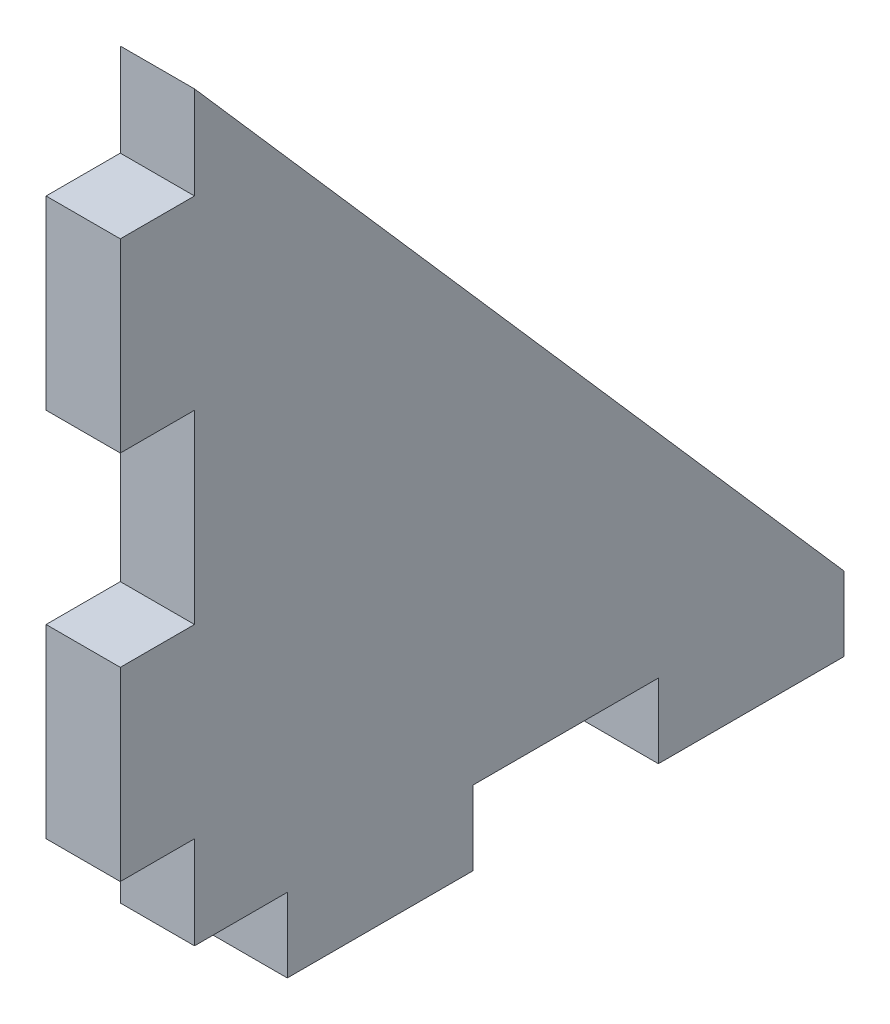
ISO-10303-21;
HEADER;
FILE_DESCRIPTION(('STEP AP214'),'2;1');
FILE_NAME('part.step','',(''),(''),'','','');
FILE_SCHEMA(('AUTOMOTIVE_DESIGN { 1 0 10303 214 1 1 1 1 }'));
ENDSEC;
DATA;
#1=APPLICATION_CONTEXT('core data for automotive mechanical design processes');
#2=APPLICATION_PROTOCOL_DEFINITION('international standard','automotive_design',2000,#1);
#3=PRODUCT_CONTEXT('',#1,'mechanical');
#4=PRODUCT('Part','Part','',(#3));
#5=PRODUCT_RELATED_PRODUCT_CATEGORY('part','',(#4));
#6=PRODUCT_DEFINITION_FORMATION('','',#4);
#7=PRODUCT_DEFINITION_CONTEXT('part definition',#1,'design');
#8=PRODUCT_DEFINITION('design','',#6,#7);
#9=PRODUCT_DEFINITION_SHAPE('','',#8);
#10=(LENGTH_UNIT() NAMED_UNIT(*) SI_UNIT(.MILLI.,.METRE.));
#11=(NAMED_UNIT(*) PLANE_ANGLE_UNIT() SI_UNIT($,.RADIAN.));
#12=(NAMED_UNIT(*) SI_UNIT($,.STERADIAN.) SOLID_ANGLE_UNIT());
#13=UNCERTAINTY_MEASURE_WITH_UNIT(LENGTH_MEASURE(1.E-05),#10,'distance_accuracy_value','');
#14=(GEOMETRIC_REPRESENTATION_CONTEXT(3) GLOBAL_UNCERTAINTY_ASSIGNED_CONTEXT((#13)) GLOBAL_UNIT_ASSIGNED_CONTEXT((#10,
#11,#12)) REPRESENTATION_CONTEXT('',''));
#15=CARTESIAN_POINT('',(0.,0.,0.));
#16=DIRECTION('',(0.,0.,1.));
#17=DIRECTION('',(1.,0.,0.));
#18=AXIS2_PLACEMENT_3D('',#15,#16,#17);
#19=CARTESIAN_POINT('',(2.,0.,-5.));
#20=DIRECTION('',(0.,1.,0.));
#21=DIRECTION('',(0.,0.,1.));
#22=AXIS2_PLACEMENT_3D('',#19,#20,#21);
#23=PLANE('',#22);
#24=DIRECTION('',(0.,0.,-1.));
#25=VECTOR('',#24,1.);
#26=CARTESIAN_POINT('',(-2.,0.,-5.));
#27=LINE('',#26,#25);
#28=CARTESIAN_POINT('',(-2.,0.,0.));
#29=VERTEX_POINT('',#28);
#30=CARTESIAN_POINT('',(-2.,0.,-5.));
#31=VERTEX_POINT('',#30);
#32=EDGE_CURVE('E198',#29,#31,#27,.T.);
#33=ORIENTED_EDGE('',*,*,#32,.T.);
#34=DIRECTION('',(-1.,0.,0.));
#35=VECTOR('',#34,1.);
#36=CARTESIAN_POINT('',(2.,0.,-5.));
#37=LINE('',#36,#35);
#38=CARTESIAN_POINT('',(2.,0.,-5.));
#39=VERTEX_POINT('',#38);
#40=EDGE_CURVE('E11',#39,#31,#37,.T.);
#41=ORIENTED_EDGE('',*,*,#40,.F.);
#42=DIRECTION('',(0.,0.,-1.));
#43=VECTOR('',#42,1.);
#44=CARTESIAN_POINT('',(2.,0.,-5.));
#45=LINE('',#44,#43);
#46=CARTESIAN_POINT('',(2.,0.,0.));
#47=VERTEX_POINT('',#46);
#48=EDGE_CURVE('E232',#47,#39,#45,.T.);
#49=ORIENTED_EDGE('',*,*,#48,.F.);
#50=DIRECTION('',(-1.,0.,0.));
#51=VECTOR('',#50,1.);
#52=CARTESIAN_POINT('',(2.,0.,0.));
#53=LINE('',#52,#51);
#54=EDGE_CURVE('E194',#47,#29,#53,.T.);
#55=ORIENTED_EDGE('',*,*,#54,.T.);
#56=EDGE_LOOP('',(#33,#41,#49,#55));
#57=FACE_BOUND('',#56,.T.);
#58=ADVANCED_FACE('F42',(#57),#23,.F.);
#59=CARTESIAN_POINT('',(2.,-4.,-5.));
#60=DIRECTION('',(0.,0.,-1.));
#61=DIRECTION('',(-1.,0.,0.));
#62=AXIS2_PLACEMENT_3D('',#59,#60,#61);
#63=PLANE('',#62);
#64=DIRECTION('',(0.,-1.,0.));
#65=VECTOR('',#64,1.);
#66=CARTESIAN_POINT('',(-2.,-4.,-5.));
#67=LINE('',#66,#65);
#68=CARTESIAN_POINT('',(-2.,-4.,-5.));
#69=VERTEX_POINT('',#68);
#70=EDGE_CURVE('E201',#31,#69,#67,.T.);
#71=ORIENTED_EDGE('',*,*,#70,.T.);
#72=DIRECTION('',(-1.,0.,0.));
#73=VECTOR('',#72,1.);
#74=CARTESIAN_POINT('',(2.,-4.,-5.));
#75=LINE('',#74,#73);
#76=CARTESIAN_POINT('',(2.,-4.,-5.));
#77=VERTEX_POINT('',#76);
#78=EDGE_CURVE('E50',#77,#69,#75,.T.);
#79=ORIENTED_EDGE('',*,*,#78,.F.);
#80=DIRECTION('',(0.,-1.,0.));
#81=VECTOR('',#80,1.);
#82=CARTESIAN_POINT('',(2.,-4.,-5.));
#83=LINE('',#82,#81);
#84=EDGE_CURVE('E131',#39,#77,#83,.T.);
#85=ORIENTED_EDGE('',*,*,#84,.F.);
#86=ORIENTED_EDGE('',*,*,#40,.T.);
#87=EDGE_LOOP('',(#71,#79,#85,#86));
#88=FACE_BOUND('',#87,.T.);
#89=ADVANCED_FACE('F340',(#88),#63,.F.);
#90=CARTESIAN_POINT('',(2.,-4.,-15.));
#91=DIRECTION('',(0.,1.,0.));
#92=DIRECTION('',(0.,0.,1.));
#93=AXIS2_PLACEMENT_3D('',#90,#91,#92);
#94=PLANE('',#93);
#95=DIRECTION('',(0.,0.,-1.));
#96=VECTOR('',#95,1.);
#97=CARTESIAN_POINT('',(-2.,-4.,-15.));
#98=LINE('',#97,#96);
#99=CARTESIAN_POINT('',(-2.,-4.,-15.));
#100=VERTEX_POINT('',#99);
#101=EDGE_CURVE('E203',#69,#100,#98,.T.);
#102=ORIENTED_EDGE('',*,*,#101,.T.);
#103=DIRECTION('',(-1.,0.,0.));
#104=VECTOR('',#103,1.);
#105=CARTESIAN_POINT('',(2.,-4.,-15.));
#106=LINE('',#105,#104);
#107=CARTESIAN_POINT('',(2.,-4.,-15.));
#108=VERTEX_POINT('',#107);
#109=EDGE_CURVE('E269',#108,#100,#106,.T.);
#110=ORIENTED_EDGE('',*,*,#109,.F.);
#111=DIRECTION('',(0.,0.,-1.));
#112=VECTOR('',#111,1.);
#113=CARTESIAN_POINT('',(2.,-4.,-15.));
#114=LINE('',#113,#112);
#115=EDGE_CURVE('E277',#77,#108,#114,.T.);
#116=ORIENTED_EDGE('',*,*,#115,.F.);
#117=ORIENTED_EDGE('',*,*,#78,.T.);
#118=EDGE_LOOP('',(#102,#110,#116,#117));
#119=FACE_BOUND('',#118,.T.);
#120=ADVANCED_FACE('F275',(#119),#94,.F.);
#121=CARTESIAN_POINT('',(2.,0.,-15.));
#122=DIRECTION('',(0.,0.,1.));
#123=DIRECTION('',(0.,-1.,0.));
#124=AXIS2_PLACEMENT_3D('',#121,#122,#123);
#125=PLANE('',#124);
#126=DIRECTION('',(0.,1.,0.));
#127=VECTOR('',#126,1.);
#128=CARTESIAN_POINT('',(-2.,0.,-15.));
#129=LINE('',#128,#127);
#130=CARTESIAN_POINT('',(-2.,0.,-15.));
#131=VERTEX_POINT('',#130);
#132=EDGE_CURVE('E205',#100,#131,#129,.T.);
#133=ORIENTED_EDGE('',*,*,#132,.T.);
#134=DIRECTION('',(-1.,0.,0.));
#135=VECTOR('',#134,1.);
#136=CARTESIAN_POINT('',(2.,0.,-15.));
#137=LINE('',#136,#135);
#138=CARTESIAN_POINT('',(2.,0.,-15.));
#139=VERTEX_POINT('',#138);
#140=EDGE_CURVE('E266',#139,#131,#137,.T.);
#141=ORIENTED_EDGE('',*,*,#140,.F.);
#142=DIRECTION('',(0.,1.,0.));
#143=VECTOR('',#142,1.);
#144=CARTESIAN_POINT('',(2.,0.,-15.));
#145=LINE('',#144,#143);
#146=EDGE_CURVE('E295',#108,#139,#145,.T.);
#147=ORIENTED_EDGE('',*,*,#146,.F.);
#148=ORIENTED_EDGE('',*,*,#109,.T.);
#149=EDGE_LOOP('',(#133,#141,#147,#148));
#150=FACE_BOUND('',#149,.T.);
#151=ADVANCED_FACE('F286',(#150),#125,.F.);
#152=CARTESIAN_POINT('',(2.,0.,-25.));
#153=DIRECTION('',(0.,1.,0.));
#154=DIRECTION('',(0.,0.,1.));
#155=AXIS2_PLACEMENT_3D('',#152,#153,#154);
#156=PLANE('',#155);
#157=DIRECTION('',(0.,0.,-1.));
#158=VECTOR('',#157,1.);
#159=CARTESIAN_POINT('',(-2.,0.,-25.));
#160=LINE('',#159,#158);
#161=CARTESIAN_POINT('',(-2.,0.,-25.));
#162=VERTEX_POINT('',#161);
#163=EDGE_CURVE('E207',#131,#162,#160,.T.);
#164=ORIENTED_EDGE('',*,*,#163,.T.);
#165=DIRECTION('',(-1.,0.,0.));
#166=VECTOR('',#165,1.);
#167=CARTESIAN_POINT('',(2.,0.,-25.));
#168=LINE('',#167,#166);
#169=CARTESIAN_POINT('',(2.,0.,-25.));
#170=VERTEX_POINT('',#169);
#171=EDGE_CURVE('E263',#170,#162,#168,.T.);
#172=ORIENTED_EDGE('',*,*,#171,.F.);
#173=DIRECTION('',(0.,0.,-1.));
#174=VECTOR('',#173,1.);
#175=CARTESIAN_POINT('',(2.,0.,-25.));
#176=LINE('',#175,#174);
#177=EDGE_CURVE('E292',#139,#170,#176,.T.);
#178=ORIENTED_EDGE('',*,*,#177,.F.);
#179=ORIENTED_EDGE('',*,*,#140,.T.);
#180=EDGE_LOOP('',(#164,#172,#178,#179));
#181=FACE_BOUND('',#180,.T.);
#182=ADVANCED_FACE('F290',(#181),#156,.F.);
#183=CARTESIAN_POINT('',(2.,-4.,-25.));
#184=DIRECTION('',(0.,0.,-1.));
#185=DIRECTION('',(-1.,0.,0.));
#186=AXIS2_PLACEMENT_3D('',#183,#184,#185);
#187=PLANE('',#186);
#188=DIRECTION('',(0.,-1.,0.));
#189=VECTOR('',#188,1.);
#190=CARTESIAN_POINT('',(-2.,-4.,-25.));
#191=LINE('',#190,#189);
#192=CARTESIAN_POINT('',(-2.,-4.,-25.));
#193=VERTEX_POINT('',#192);
#194=EDGE_CURVE('E209',#162,#193,#191,.T.);
#195=ORIENTED_EDGE('',*,*,#194,.T.);
#196=DIRECTION('',(-1.,0.,0.));
#197=VECTOR('',#196,1.);
#198=CARTESIAN_POINT('',(2.,-4.,-25.));
#199=LINE('',#198,#197);
#200=CARTESIAN_POINT('',(2.,-4.,-25.));
#201=VERTEX_POINT('',#200);
#202=EDGE_CURVE('E260',#201,#193,#199,.T.);
#203=ORIENTED_EDGE('',*,*,#202,.F.);
#204=DIRECTION('',(0.,-1.,0.));
#205=VECTOR('',#204,1.);
#206=CARTESIAN_POINT('',(2.,-4.,-25.));
#207=LINE('',#206,#205);
#208=EDGE_CURVE('E294',#170,#201,#207,.T.);
#209=ORIENTED_EDGE('',*,*,#208,.F.);
#210=ORIENTED_EDGE('',*,*,#171,.T.);
#211=EDGE_LOOP('',(#195,#203,#209,#210));
#212=FACE_BOUND('',#211,.T.);
#213=ADVANCED_FACE('F353',(#212),#187,.F.);
#214=CARTESIAN_POINT('',(2.,-4.,-35.));
#215=DIRECTION('',(0.,1.,0.));
#216=DIRECTION('',(0.,0.,1.));
#217=AXIS2_PLACEMENT_3D('',#214,#215,#216);
#218=PLANE('',#217);
#219=DIRECTION('',(0.,0.,-1.));
#220=VECTOR('',#219,1.);
#221=CARTESIAN_POINT('',(-2.,-4.,-35.));
#222=LINE('',#221,#220);
#223=CARTESIAN_POINT('',(-2.,-4.,-35.));
#224=VERTEX_POINT('',#223);
#225=EDGE_CURVE('E211',#193,#224,#222,.T.);
#226=ORIENTED_EDGE('',*,*,#225,.T.);
#227=DIRECTION('',(-1.,0.,0.));
#228=VECTOR('',#227,1.);
#229=CARTESIAN_POINT('',(2.,-4.,-35.));
#230=LINE('',#229,#228);
#231=CARTESIAN_POINT('',(2.,-4.,-35.));
#232=VERTEX_POINT('',#231);
#233=EDGE_CURVE('E257',#232,#224,#230,.T.);
#234=ORIENTED_EDGE('',*,*,#233,.F.);
#235=DIRECTION('',(0.,0.,-1.));
#236=VECTOR('',#235,1.);
#237=CARTESIAN_POINT('',(2.,-4.,-35.));
#238=LINE('',#237,#236);
#239=EDGE_CURVE('E297',#201,#232,#238,.T.);
#240=ORIENTED_EDGE('',*,*,#239,.F.);
#241=ORIENTED_EDGE('',*,*,#202,.T.);
#242=EDGE_LOOP('',(#226,#234,#240,#241));
#243=FACE_BOUND('',#242,.T.);
#244=ADVANCED_FACE('F356',(#243),#218,.F.);
#245=CARTESIAN_POINT('',(2.,0.,-35.));
#246=DIRECTION('',(0.,0.,1.));
#247=DIRECTION('',(1.,0.,0.));
#248=AXIS2_PLACEMENT_3D('',#245,#246,#247);
#249=PLANE('',#248);
#250=DIRECTION('',(0.,1.,0.));
#251=VECTOR('',#250,1.);
#252=CARTESIAN_POINT('',(-2.,0.,-35.));
#253=LINE('',#252,#251);
#254=CARTESIAN_POINT('',(-2.,0.,-35.));
#255=VERTEX_POINT('',#254);
#256=EDGE_CURVE('E213',#224,#255,#253,.T.);
#257=ORIENTED_EDGE('',*,*,#256,.T.);
#258=DIRECTION('',(-1.,0.,0.));
#259=VECTOR('',#258,1.);
#260=CARTESIAN_POINT('',(2.,0.,-35.));
#261=LINE('',#260,#259);
#262=CARTESIAN_POINT('',(2.,0.,-35.));
#263=VERTEX_POINT('',#262);
#264=EDGE_CURVE('E254',#263,#255,#261,.T.);
#265=ORIENTED_EDGE('',*,*,#264,.F.);
#266=DIRECTION('',(0.,1.,0.));
#267=VECTOR('',#266,1.);
#268=CARTESIAN_POINT('',(2.,0.,-35.));
#269=LINE('',#268,#267);
#270=EDGE_CURVE('E303',#232,#263,#269,.T.);
#271=ORIENTED_EDGE('',*,*,#270,.F.);
#272=ORIENTED_EDGE('',*,*,#233,.T.);
#273=EDGE_LOOP('',(#257,#265,#271,#272));
#274=FACE_BOUND('',#273,.T.);
#275=ADVANCED_FACE('F360',(#274),#249,.F.);
#276=CARTESIAN_POINT('',(2.,40.,0.));
#277=DIRECTION('',(0.,-0.658504607868518,0.752576694706878));
#278=DIRECTION('',(0.,-0.752576694706878,-0.658504607868518));
#279=AXIS2_PLACEMENT_3D('',#276,#277,#278);
#280=PLANE('',#279);
#281=DIRECTION('',(0.,0.752576694706878,0.658504607868518));
#282=VECTOR('',#281,1.);
#283=CARTESIAN_POINT('',(-2.,40.,0.));
#284=LINE('',#283,#282);
#285=CARTESIAN_POINT('',(-2.,40.,0.));
#286=VERTEX_POINT('',#285);
#287=EDGE_CURVE('E215',#255,#286,#284,.T.);
#288=ORIENTED_EDGE('',*,*,#287,.T.);
#289=DIRECTION('',(-1.,0.,0.));
#290=VECTOR('',#289,1.);
#291=CARTESIAN_POINT('',(2.,40.,0.));
#292=LINE('',#291,#290);
#293=CARTESIAN_POINT('',(2.,40.,0.));
#294=VERTEX_POINT('',#293);
#295=EDGE_CURVE('E251',#294,#286,#292,.T.);
#296=ORIENTED_EDGE('',*,*,#295,.F.);
#297=DIRECTION('',(0.,0.752576694706878,0.658504607868518));
#298=VECTOR('',#297,1.);
#299=CARTESIAN_POINT('',(2.,40.,0.));
#300=LINE('',#299,#298);
#301=EDGE_CURVE('E305',#263,#294,#300,.T.);
#302=ORIENTED_EDGE('',*,*,#301,.F.);
#303=ORIENTED_EDGE('',*,*,#264,.T.);
#304=EDGE_LOOP('',(#288,#296,#302,#303));
#305=FACE_BOUND('',#304,.T.);
#306=ADVANCED_FACE('F364',(#305),#280,.F.);
#307=CARTESIAN_POINT('',(2.,35.,0.));
#308=DIRECTION('',(0.,0.,-1.));
#309=DIRECTION('',(-1.,0.,0.));
#310=AXIS2_PLACEMENT_3D('',#307,#308,#309);
#311=PLANE('',#310);
#312=DIRECTION('',(0.,-1.,0.));
#313=VECTOR('',#312,1.);
#314=CARTESIAN_POINT('',(-2.,35.,0.));
#315=LINE('',#314,#313);
#316=CARTESIAN_POINT('',(-2.,35.,0.));
#317=VERTEX_POINT('',#316);
#318=EDGE_CURVE('E217',#286,#317,#315,.T.);
#319=ORIENTED_EDGE('',*,*,#318,.T.);
#320=DIRECTION('',(-1.,0.,0.));
#321=VECTOR('',#320,1.);
#322=CARTESIAN_POINT('',(2.,35.,0.));
#323=LINE('',#322,#321);
#324=CARTESIAN_POINT('',(2.,35.,0.));
#325=VERTEX_POINT('',#324);
#326=EDGE_CURVE('E248',#325,#317,#323,.T.);
#327=ORIENTED_EDGE('',*,*,#326,.F.);
#328=DIRECTION('',(0.,-1.,0.));
#329=VECTOR('',#328,1.);
#330=CARTESIAN_POINT('',(2.,35.,0.));
#331=LINE('',#330,#329);
#332=EDGE_CURVE('E307',#294,#325,#331,.T.);
#333=ORIENTED_EDGE('',*,*,#332,.F.);
#334=ORIENTED_EDGE('',*,*,#295,.T.);
#335=EDGE_LOOP('',(#319,#327,#333,#334));
#336=FACE_BOUND('',#335,.T.);
#337=ADVANCED_FACE('F368',(#336),#311,.F.);
#338=CARTESIAN_POINT('',(2.,35.,4.));
#339=DIRECTION('',(0.,-1.,0.));
#340=DIRECTION('',(0.,0.,-1.));
#341=AXIS2_PLACEMENT_3D('',#338,#339,#340);
#342=PLANE('',#341);
#343=DIRECTION('',(0.,0.,1.));
#344=VECTOR('',#343,1.);
#345=CARTESIAN_POINT('',(-2.,35.,4.));
#346=LINE('',#345,#344);
#347=CARTESIAN_POINT('',(-2.,35.,4.));
#348=VERTEX_POINT('',#347);
#349=EDGE_CURVE('E219',#317,#348,#346,.T.);
#350=ORIENTED_EDGE('',*,*,#349,.T.);
#351=DIRECTION('',(-1.,0.,0.));
#352=VECTOR('',#351,1.);
#353=CARTESIAN_POINT('',(2.,35.,4.));
#354=LINE('',#353,#352);
#355=CARTESIAN_POINT('',(2.,35.,4.));
#356=VERTEX_POINT('',#355);
#357=EDGE_CURVE('E245',#356,#348,#354,.T.);
#358=ORIENTED_EDGE('',*,*,#357,.F.);
#359=DIRECTION('',(0.,0.,1.));
#360=VECTOR('',#359,1.);
#361=CARTESIAN_POINT('',(2.,35.,4.));
#362=LINE('',#361,#360);
#363=EDGE_CURVE('E309',#325,#356,#362,.T.);
#364=ORIENTED_EDGE('',*,*,#363,.F.);
#365=ORIENTED_EDGE('',*,*,#326,.T.);
#366=EDGE_LOOP('',(#350,#358,#364,#365));
#367=FACE_BOUND('',#366,.T.);
#368=ADVANCED_FACE('F372',(#367),#342,.F.);
#369=CARTESIAN_POINT('',(2.,25.,4.));
#370=DIRECTION('',(0.,0.,-1.));
#371=DIRECTION('',(-1.,0.,0.));
#372=AXIS2_PLACEMENT_3D('',#369,#370,#371);
#373=PLANE('',#372);
#374=DIRECTION('',(0.,-1.,0.));
#375=VECTOR('',#374,1.);
#376=CARTESIAN_POINT('',(-2.,25.,4.));
#377=LINE('',#376,#375);
#378=CARTESIAN_POINT('',(-2.,25.,4.));
#379=VERTEX_POINT('',#378);
#380=EDGE_CURVE('E221',#348,#379,#377,.T.);
#381=ORIENTED_EDGE('',*,*,#380,.T.);
#382=DIRECTION('',(-1.,0.,0.));
#383=VECTOR('',#382,1.);
#384=CARTESIAN_POINT('',(2.,25.,4.));
#385=LINE('',#384,#383);
#386=CARTESIAN_POINT('',(2.,25.,4.));
#387=VERTEX_POINT('',#386);
#388=EDGE_CURVE('E242',#387,#379,#385,.T.);
#389=ORIENTED_EDGE('',*,*,#388,.F.);
#390=DIRECTION('',(0.,-1.,0.));
#391=VECTOR('',#390,1.);
#392=CARTESIAN_POINT('',(2.,25.,4.));
#393=LINE('',#392,#391);
#394=EDGE_CURVE('E311',#356,#387,#393,.T.);
#395=ORIENTED_EDGE('',*,*,#394,.F.);
#396=ORIENTED_EDGE('',*,*,#357,.T.);
#397=EDGE_LOOP('',(#381,#389,#395,#396));
#398=FACE_BOUND('',#397,.T.);
#399=ADVANCED_FACE('F376',(#398),#373,.F.);
#400=CARTESIAN_POINT('',(2.,25.,0.));
#401=DIRECTION('',(0.,1.,0.));
#402=DIRECTION('',(0.,0.,1.));
#403=AXIS2_PLACEMENT_3D('',#400,#401,#402);
#404=PLANE('',#403);
#405=DIRECTION('',(0.,0.,-1.));
#406=VECTOR('',#405,1.);
#407=CARTESIAN_POINT('',(-2.,25.,0.));
#408=LINE('',#407,#406);
#409=CARTESIAN_POINT('',(-2.,25.,0.));
#410=VERTEX_POINT('',#409);
#411=EDGE_CURVE('E223',#379,#410,#408,.T.);
#412=ORIENTED_EDGE('',*,*,#411,.T.);
#413=DIRECTION('',(-1.,0.,0.));
#414=VECTOR('',#413,1.);
#415=CARTESIAN_POINT('',(2.,25.,0.));
#416=LINE('',#415,#414);
#417=CARTESIAN_POINT('',(2.,25.,0.));
#418=VERTEX_POINT('',#417);
#419=EDGE_CURVE('E239',#418,#410,#416,.T.);
#420=ORIENTED_EDGE('',*,*,#419,.F.);
#421=DIRECTION('',(0.,0.,-1.));
#422=VECTOR('',#421,1.);
#423=CARTESIAN_POINT('',(2.,25.,0.));
#424=LINE('',#423,#422);
#425=EDGE_CURVE('E313',#387,#418,#424,.T.);
#426=ORIENTED_EDGE('',*,*,#425,.F.);
#427=ORIENTED_EDGE('',*,*,#388,.T.);
#428=EDGE_LOOP('',(#412,#420,#426,#427));
#429=FACE_BOUND('',#428,.T.);
#430=ADVANCED_FACE('F380',(#429),#404,.F.);
#431=CARTESIAN_POINT('',(2.,15.,0.));
#432=DIRECTION('',(0.,0.,-1.));
#433=DIRECTION('',(-1.,0.,0.));
#434=AXIS2_PLACEMENT_3D('',#431,#432,#433);
#435=PLANE('',#434);
#436=DIRECTION('',(0.,-1.,0.));
#437=VECTOR('',#436,1.);
#438=CARTESIAN_POINT('',(-2.,15.,0.));
#439=LINE('',#438,#437);
#440=CARTESIAN_POINT('',(-2.,15.,0.));
#441=VERTEX_POINT('',#440);
#442=EDGE_CURVE('E225',#410,#441,#439,.T.);
#443=ORIENTED_EDGE('',*,*,#442,.T.);
#444=DIRECTION('',(-1.,0.,0.));
#445=VECTOR('',#444,1.);
#446=CARTESIAN_POINT('',(2.,15.,0.));
#447=LINE('',#446,#445);
#448=CARTESIAN_POINT('',(2.,15.,0.));
#449=VERTEX_POINT('',#448);
#450=EDGE_CURVE('E236',#449,#441,#447,.T.);
#451=ORIENTED_EDGE('',*,*,#450,.F.);
#452=DIRECTION('',(0.,-1.,0.));
#453=VECTOR('',#452,1.);
#454=CARTESIAN_POINT('',(2.,15.,0.));
#455=LINE('',#454,#453);
#456=EDGE_CURVE('E315',#418,#449,#455,.T.);
#457=ORIENTED_EDGE('',*,*,#456,.F.);
#458=ORIENTED_EDGE('',*,*,#419,.T.);
#459=EDGE_LOOP('',(#443,#451,#457,#458));
#460=FACE_BOUND('',#459,.T.);
#461=ADVANCED_FACE('F321',(#460),#435,.F.);
#462=CARTESIAN_POINT('',(2.,15.,4.));
#463=DIRECTION('',(0.,-1.,0.));
#464=DIRECTION('',(0.,0.,-1.));
#465=AXIS2_PLACEMENT_3D('',#462,#463,#464);
#466=PLANE('',#465);
#467=DIRECTION('',(0.,0.,1.));
#468=VECTOR('',#467,1.);
#469=CARTESIAN_POINT('',(-2.,15.,4.));
#470=LINE('',#469,#468);
#471=CARTESIAN_POINT('',(-2.,15.,4.));
#472=VERTEX_POINT('',#471);
#473=EDGE_CURVE('E227',#441,#472,#470,.T.);
#474=ORIENTED_EDGE('',*,*,#473,.T.);
#475=DIRECTION('',(-1.,0.,0.));
#476=VECTOR('',#475,1.);
#477=CARTESIAN_POINT('',(2.,15.,4.));
#478=LINE('',#477,#476);
#479=CARTESIAN_POINT('',(2.,15.,4.));
#480=VERTEX_POINT('',#479);
#481=EDGE_CURVE('E189',#480,#472,#478,.T.);
#482=ORIENTED_EDGE('',*,*,#481,.F.);
#483=DIRECTION('',(0.,0.,1.));
#484=VECTOR('',#483,1.);
#485=CARTESIAN_POINT('',(2.,15.,4.));
#486=LINE('',#485,#484);
#487=EDGE_CURVE('E180',#449,#480,#486,.T.);
#488=ORIENTED_EDGE('',*,*,#487,.F.);
#489=ORIENTED_EDGE('',*,*,#450,.T.);
#490=EDGE_LOOP('',(#474,#482,#488,#489));
#491=FACE_BOUND('',#490,.T.);
#492=ADVANCED_FACE('F325',(#491),#466,.F.);
#493=CARTESIAN_POINT('',(2.,5.,4.));
#494=DIRECTION('',(0.,0.,-1.));
#495=DIRECTION('',(0.,1.,0.));
#496=AXIS2_PLACEMENT_3D('',#493,#494,#495);
#497=PLANE('',#496);
#498=DIRECTION('',(0.,-1.,0.));
#499=VECTOR('',#498,1.);
#500=CARTESIAN_POINT('',(-2.,5.,4.));
#501=LINE('',#500,#499);
#502=CARTESIAN_POINT('',(-2.,5.,4.));
#503=VERTEX_POINT('',#502);
#504=EDGE_CURVE('E188',#472,#503,#501,.T.);
#505=ORIENTED_EDGE('',*,*,#504,.T.);
#506=DIRECTION('',(-1.,0.,0.));
#507=VECTOR('',#506,1.);
#508=CARTESIAN_POINT('',(2.,5.,4.));
#509=LINE('',#508,#507);
#510=CARTESIAN_POINT('',(2.,5.,4.));
#511=VERTEX_POINT('',#510);
#512=EDGE_CURVE('E185',#511,#503,#509,.T.);
#513=ORIENTED_EDGE('',*,*,#512,.F.);
#514=DIRECTION('',(0.,-1.,0.));
#515=VECTOR('',#514,1.);
#516=CARTESIAN_POINT('',(2.,5.,4.));
#517=LINE('',#516,#515);
#518=EDGE_CURVE('E174',#480,#511,#517,.T.);
#519=ORIENTED_EDGE('',*,*,#518,.F.);
#520=ORIENTED_EDGE('',*,*,#481,.T.);
#521=EDGE_LOOP('',(#505,#513,#519,#520));
#522=FACE_BOUND('',#521,.T.);
#523=ADVANCED_FACE('F186',(#522),#497,.F.);
#524=CARTESIAN_POINT('',(2.,5.,0.));
#525=DIRECTION('',(0.,1.,0.));
#526=DIRECTION('',(0.,0.,1.));
#527=AXIS2_PLACEMENT_3D('',#524,#525,#526);
#528=PLANE('',#527);
#529=DIRECTION('',(0.,0.,-1.));
#530=VECTOR('',#529,1.);
#531=CARTESIAN_POINT('',(-2.,5.,0.));
#532=LINE('',#531,#530);
#533=CARTESIAN_POINT('',(-2.,5.,0.));
#534=VERTEX_POINT('',#533);
#535=EDGE_CURVE('E117',#503,#534,#532,.T.);
#536=ORIENTED_EDGE('',*,*,#535,.T.);
#537=DIRECTION('',(-1.,0.,0.));
#538=VECTOR('',#537,1.);
#539=CARTESIAN_POINT('',(2.,5.,0.));
#540=LINE('',#539,#538);
#541=CARTESIAN_POINT('',(2.,5.,0.));
#542=VERTEX_POINT('',#541);
#543=EDGE_CURVE('E190',#542,#534,#540,.T.);
#544=ORIENTED_EDGE('',*,*,#543,.F.);
#545=DIRECTION('',(0.,0.,-1.));
#546=VECTOR('',#545,1.);
#547=CARTESIAN_POINT('',(2.,5.,0.));
#548=LINE('',#547,#546);
#549=EDGE_CURVE('E178',#511,#542,#548,.T.);
#550=ORIENTED_EDGE('',*,*,#549,.F.);
#551=ORIENTED_EDGE('',*,*,#512,.T.);
#552=EDGE_LOOP('',(#536,#544,#550,#551));
#553=FACE_BOUND('',#552,.T.);
#554=ADVANCED_FACE('F192',(#553),#528,.F.);
#555=CARTESIAN_POINT('',(2.,0.,0.));
#556=DIRECTION('',(0.,0.,-1.));
#557=DIRECTION('',(-1.,0.,0.));
#558=AXIS2_PLACEMENT_3D('',#555,#556,#557);
#559=PLANE('',#558);
#560=DIRECTION('',(0.,-1.,0.));
#561=VECTOR('',#560,1.);
#562=CARTESIAN_POINT('',(-2.,0.,0.));
#563=LINE('',#562,#561);
#564=EDGE_CURVE('E123',#534,#29,#563,.T.);
#565=ORIENTED_EDGE('',*,*,#564,.T.);
#566=ORIENTED_EDGE('',*,*,#54,.F.);
#567=DIRECTION('',(0.,-1.,0.));
#568=VECTOR('',#567,1.);
#569=CARTESIAN_POINT('',(2.,0.,0.));
#570=LINE('',#569,#568);
#571=EDGE_CURVE('E58',#542,#47,#570,.T.);
#572=ORIENTED_EDGE('',*,*,#571,.F.);
#573=ORIENTED_EDGE('',*,*,#543,.T.);
#574=EDGE_LOOP('',(#565,#566,#572,#573));
#575=FACE_BOUND('',#574,.T.);
#576=ADVANCED_FACE('F329',(#575),#559,.F.);
#577=CARTESIAN_POINT('',(2.,0.,0.));
#578=DIRECTION('',(-1.,0.,0.));
#579=DIRECTION('',(0.,0.,1.));
#580=AXIS2_PLACEMENT_3D('',#577,#578,#579);
#581=PLANE('',#580);
#582=ORIENTED_EDGE('',*,*,#48,.T.);
#583=ORIENTED_EDGE('',*,*,#84,.T.);
#584=ORIENTED_EDGE('',*,*,#115,.T.);
#585=ORIENTED_EDGE('',*,*,#146,.T.);
#586=ORIENTED_EDGE('',*,*,#177,.T.);
#587=ORIENTED_EDGE('',*,*,#208,.T.);
#588=ORIENTED_EDGE('',*,*,#239,.T.);
#589=ORIENTED_EDGE('',*,*,#270,.T.);
#590=ORIENTED_EDGE('',*,*,#301,.T.);
#591=ORIENTED_EDGE('',*,*,#332,.T.);
#592=ORIENTED_EDGE('',*,*,#363,.T.);
#593=ORIENTED_EDGE('',*,*,#394,.T.);
#594=ORIENTED_EDGE('',*,*,#425,.T.);
#595=ORIENTED_EDGE('',*,*,#456,.T.);
#596=ORIENTED_EDGE('',*,*,#487,.T.);
#597=ORIENTED_EDGE('',*,*,#518,.T.);
#598=ORIENTED_EDGE('',*,*,#549,.T.);
#599=ORIENTED_EDGE('',*,*,#571,.T.);
#600=EDGE_LOOP('',(#582,#583,#584,#585,#586,#587,#588,#589,#590,#591,#592,#593,#594,#595,#596,
#597,#598,#599));
#601=FACE_BOUND('',#600,.T.);
#602=ADVANCED_FACE('F176',(#601),#581,.F.);
#603=CARTESIAN_POINT('',(-2.,0.,0.));
#604=DIRECTION('',(-1.,0.,0.));
#605=DIRECTION('',(0.,0.,1.));
#606=AXIS2_PLACEMENT_3D('',#603,#604,#605);
#607=PLANE('',#606);
#608=ORIENTED_EDGE('',*,*,#32,.F.);
#609=ORIENTED_EDGE('',*,*,#564,.F.);
#610=ORIENTED_EDGE('',*,*,#535,.F.);
#611=ORIENTED_EDGE('',*,*,#504,.F.);
#612=ORIENTED_EDGE('',*,*,#473,.F.);
#613=ORIENTED_EDGE('',*,*,#442,.F.);
#614=ORIENTED_EDGE('',*,*,#411,.F.);
#615=ORIENTED_EDGE('',*,*,#380,.F.);
#616=ORIENTED_EDGE('',*,*,#349,.F.);
#617=ORIENTED_EDGE('',*,*,#318,.F.);
#618=ORIENTED_EDGE('',*,*,#287,.F.);
#619=ORIENTED_EDGE('',*,*,#256,.F.);
#620=ORIENTED_EDGE('',*,*,#225,.F.);
#621=ORIENTED_EDGE('',*,*,#194,.F.);
#622=ORIENTED_EDGE('',*,*,#163,.F.);
#623=ORIENTED_EDGE('',*,*,#132,.F.);
#624=ORIENTED_EDGE('',*,*,#101,.F.);
#625=ORIENTED_EDGE('',*,*,#70,.F.);
#626=EDGE_LOOP('',(#608,#609,#610,#611,#612,#613,#614,#615,#616,#617,#618,#619,#620,#621,#622,
#623,#624,#625));
#627=FACE_BOUND('',#626,.T.);
#628=ADVANCED_FACE('F281',(#627),#607,.T.);
#629=CLOSED_SHELL('',(#58,#89,#120,#151,#182,#213,#244,#275,#306,#337,#368,#399,#430,#461,#492,
#523,#554,#576,#602,#628));
#630=MANIFOLD_SOLID_BREP('B2',#629);
#631=ADVANCED_BREP_SHAPE_REPRESENTATION('',(#18,#630),#14);
#632=SHAPE_DEFINITION_REPRESENTATION(#9,#631);
ENDSEC;
END-ISO-10303-21;
